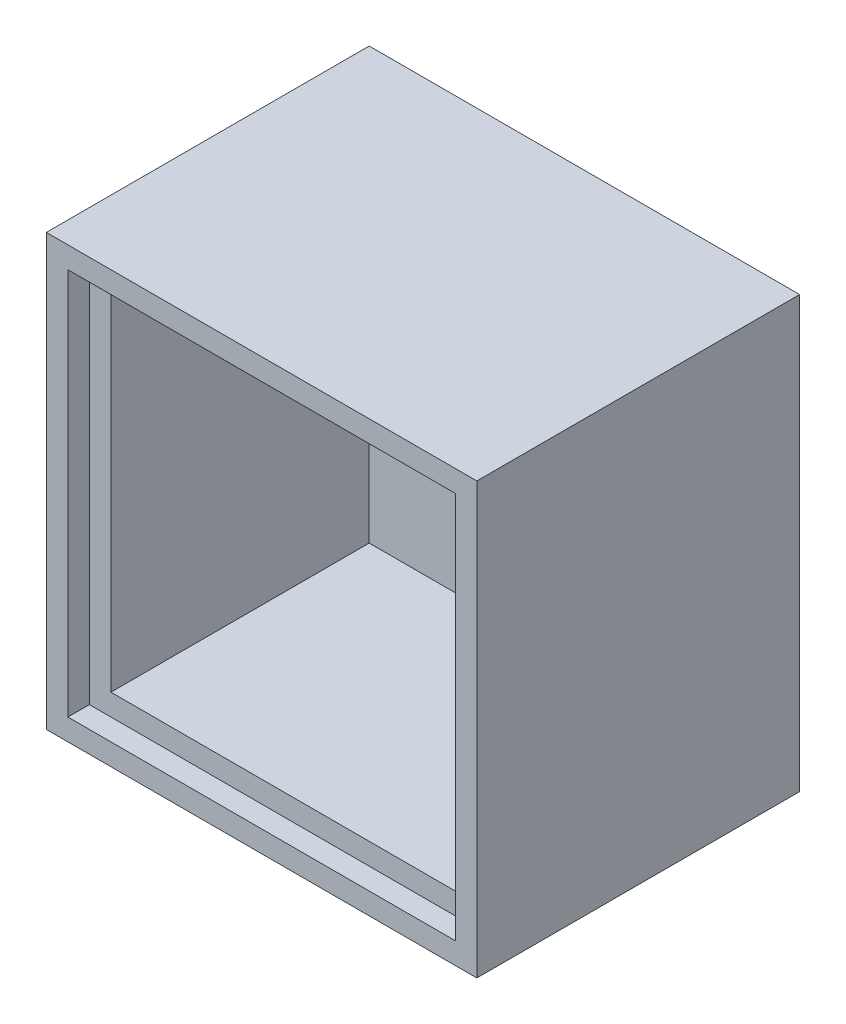
ISO-10303-21;
HEADER;
FILE_DESCRIPTION(('STEP AP214'),'2;1');
FILE_NAME('part.step','',(''),(''),'','','');
FILE_SCHEMA(('AUTOMOTIVE_DESIGN { 1 0 10303 214 1 1 1 1 }'));
ENDSEC;
DATA;
#1=APPLICATION_CONTEXT('core data for automotive mechanical design processes');
#2=APPLICATION_PROTOCOL_DEFINITION('international standard','automotive_design',2000,#1);
#3=PRODUCT_CONTEXT('',#1,'mechanical');
#4=PRODUCT('Part','Part','',(#3));
#5=PRODUCT_RELATED_PRODUCT_CATEGORY('part','',(#4));
#6=PRODUCT_DEFINITION_FORMATION('','',#4);
#7=PRODUCT_DEFINITION_CONTEXT('part definition',#1,'design');
#8=PRODUCT_DEFINITION('design','',#6,#7);
#9=PRODUCT_DEFINITION_SHAPE('','',#8);
#10=(LENGTH_UNIT() NAMED_UNIT(*) SI_UNIT(.MILLI.,.METRE.));
#11=(NAMED_UNIT(*) PLANE_ANGLE_UNIT() SI_UNIT($,.RADIAN.));
#12=(NAMED_UNIT(*) SI_UNIT($,.STERADIAN.) SOLID_ANGLE_UNIT());
#13=UNCERTAINTY_MEASURE_WITH_UNIT(LENGTH_MEASURE(1.E-05),#10,'distance_accuracy_value','');
#14=(GEOMETRIC_REPRESENTATION_CONTEXT(3) GLOBAL_UNCERTAINTY_ASSIGNED_CONTEXT((#13)) GLOBAL_UNIT_ASSIGNED_CONTEXT((#10,
#11,#12)) REPRESENTATION_CONTEXT('',''));
#15=CARTESIAN_POINT('',(0.,0.,0.));
#16=DIRECTION('',(0.,0.,1.));
#17=DIRECTION('',(1.,0.,0.));
#18=AXIS2_PLACEMENT_3D('',#15,#16,#17);
#19=CARTESIAN_POINT('',(50.,50.,75.));
#20=DIRECTION('',(-1.,0.,0.));
#21=DIRECTION('',(0.,-1.,0.));
#22=AXIS2_PLACEMENT_3D('',#19,#20,#21);
#23=PLANE('',#22);
#24=DIRECTION('',(0.,1.,0.));
#25=VECTOR('',#24,1.);
#26=CARTESIAN_POINT('',(50.,50.,0.));
#27=LINE('',#26,#25);
#28=CARTESIAN_POINT('',(50.,-50.,0.));
#29=VERTEX_POINT('',#28);
#30=CARTESIAN_POINT('',(50.,50.,0.));
#31=VERTEX_POINT('',#30);
#32=EDGE_CURVE('E169',#29,#31,#27,.T.);
#33=ORIENTED_EDGE('',*,*,#32,.T.);
#34=DIRECTION('',(0.,0.,-1.));
#35=VECTOR('',#34,1.);
#36=CARTESIAN_POINT('',(50.,50.,75.));
#37=LINE('',#36,#35);
#38=CARTESIAN_POINT('',(50.,50.,75.));
#39=VERTEX_POINT('',#38);
#40=EDGE_CURVE('E40',#39,#31,#37,.T.);
#41=ORIENTED_EDGE('',*,*,#40,.F.);
#42=DIRECTION('',(0.,1.,0.));
#43=VECTOR('',#42,1.);
#44=CARTESIAN_POINT('',(50.,50.,75.));
#45=LINE('',#44,#43);
#46=CARTESIAN_POINT('',(50.,-50.,75.));
#47=VERTEX_POINT('',#46);
#48=EDGE_CURVE('E184',#47,#39,#45,.T.);
#49=ORIENTED_EDGE('',*,*,#48,.F.);
#50=DIRECTION('',(0.,0.,-1.));
#51=VECTOR('',#50,1.);
#52=CARTESIAN_POINT('',(50.,-50.,75.));
#53=LINE('',#52,#51);
#54=EDGE_CURVE('E194',#47,#29,#53,.T.);
#55=ORIENTED_EDGE('',*,*,#54,.T.);
#56=EDGE_LOOP('',(#33,#41,#49,#55));
#57=FACE_BOUND('',#56,.T.);
#58=ADVANCED_FACE('F33',(#57),#23,.F.);
#59=CARTESIAN_POINT('',(-50.,50.,75.));
#60=DIRECTION('',(0.,-1.,0.));
#61=DIRECTION('',(0.,0.,-1.));
#62=AXIS2_PLACEMENT_3D('',#59,#60,#61);
#63=PLANE('',#62);
#64=DIRECTION('',(-1.,0.,0.));
#65=VECTOR('',#64,1.);
#66=CARTESIAN_POINT('',(-50.,50.,0.));
#67=LINE('',#66,#65);
#68=CARTESIAN_POINT('',(-50.,50.,0.));
#69=VERTEX_POINT('',#68);
#70=EDGE_CURVE('E197',#31,#69,#67,.T.);
#71=ORIENTED_EDGE('',*,*,#70,.T.);
#72=DIRECTION('',(0.,0.,-1.));
#73=VECTOR('',#72,1.);
#74=CARTESIAN_POINT('',(-50.,50.,75.));
#75=LINE('',#74,#73);
#76=CARTESIAN_POINT('',(-50.,50.,75.));
#77=VERTEX_POINT('',#76);
#78=EDGE_CURVE('E207',#77,#69,#75,.T.);
#79=ORIENTED_EDGE('',*,*,#78,.F.);
#80=DIRECTION('',(-1.,0.,0.));
#81=VECTOR('',#80,1.);
#82=CARTESIAN_POINT('',(-50.,50.,75.));
#83=LINE('',#82,#81);
#84=EDGE_CURVE('E187',#39,#77,#83,.T.);
#85=ORIENTED_EDGE('',*,*,#84,.F.);
#86=ORIENTED_EDGE('',*,*,#40,.T.);
#87=EDGE_LOOP('',(#71,#79,#85,#86));
#88=FACE_BOUND('',#87,.T.);
#89=ADVANCED_FACE('F212',(#88),#63,.F.);
#90=CARTESIAN_POINT('',(-50.,50.,75.));
#91=DIRECTION('',(1.,0.,0.));
#92=DIRECTION('',(0.,1.,0.));
#93=AXIS2_PLACEMENT_3D('',#90,#91,#92);
#94=PLANE('',#93);
#95=DIRECTION('',(0.,-1.,0.));
#96=VECTOR('',#95,1.);
#97=CARTESIAN_POINT('',(-50.,50.,0.));
#98=LINE('',#97,#96);
#99=CARTESIAN_POINT('',(-50.,-50.,0.));
#100=VERTEX_POINT('',#99);
#101=EDGE_CURVE('E199',#69,#100,#98,.T.);
#102=ORIENTED_EDGE('',*,*,#101,.T.);
#103=DIRECTION('',(0.,0.,-1.));
#104=VECTOR('',#103,1.);
#105=CARTESIAN_POINT('',(-50.,-50.,75.));
#106=LINE('',#105,#104);
#107=CARTESIAN_POINT('',(-50.,-50.,75.));
#108=VERTEX_POINT('',#107);
#109=EDGE_CURVE('E204',#108,#100,#106,.T.);
#110=ORIENTED_EDGE('',*,*,#109,.F.);
#111=DIRECTION('',(0.,-1.,0.));
#112=VECTOR('',#111,1.);
#113=CARTESIAN_POINT('',(-50.,50.,75.));
#114=LINE('',#113,#112);
#115=EDGE_CURVE('E190',#77,#108,#114,.T.);
#116=ORIENTED_EDGE('',*,*,#115,.F.);
#117=ORIENTED_EDGE('',*,*,#78,.T.);
#118=EDGE_LOOP('',(#102,#110,#116,#117));
#119=FACE_BOUND('',#118,.T.);
#120=ADVANCED_FACE('F224',(#119),#94,.F.);
#121=CARTESIAN_POINT('',(-50.,-50.,75.));
#122=DIRECTION('',(0.,1.,0.));
#123=DIRECTION('',(0.,0.,1.));
#124=AXIS2_PLACEMENT_3D('',#121,#122,#123);
#125=PLANE('',#124);
#126=DIRECTION('',(1.,0.,0.));
#127=VECTOR('',#126,1.);
#128=CARTESIAN_POINT('',(-50.,-50.,0.));
#129=LINE('',#128,#127);
#130=EDGE_CURVE('E188',#100,#29,#129,.T.);
#131=ORIENTED_EDGE('',*,*,#130,.T.);
#132=ORIENTED_EDGE('',*,*,#54,.F.);
#133=DIRECTION('',(1.,0.,0.));
#134=VECTOR('',#133,1.);
#135=CARTESIAN_POINT('',(-50.,-50.,75.));
#136=LINE('',#135,#134);
#137=EDGE_CURVE('E192',#108,#47,#136,.T.);
#138=ORIENTED_EDGE('',*,*,#137,.F.);
#139=ORIENTED_EDGE('',*,*,#109,.T.);
#140=EDGE_LOOP('',(#131,#132,#138,#139));
#141=FACE_BOUND('',#140,.T.);
#142=ADVANCED_FACE('F228',(#141),#125,.F.);
#143=CARTESIAN_POINT('',(0.,0.,75.));
#144=DIRECTION('',(0.,0.,1.));
#145=DIRECTION('',(1.,0.,0.));
#146=AXIS2_PLACEMENT_3D('',#143,#144,#145);
#147=PLANE('',#146);
#148=DIRECTION('',(0.,1.,0.));
#149=VECTOR('',#148,1.);
#150=CARTESIAN_POINT('',(45.,-45.,75.));
#151=LINE('',#150,#149);
#152=CARTESIAN_POINT('',(45.,-45.,75.));
#153=VERTEX_POINT('',#152);
#154=CARTESIAN_POINT('',(45.,45.,75.));
#155=VERTEX_POINT('',#154);
#156=EDGE_CURVE('E47',#153,#155,#151,.T.);
#157=ORIENTED_EDGE('',*,*,#156,.F.);
#158=DIRECTION('',(1.,0.,0.));
#159=VECTOR('',#158,1.);
#160=CARTESIAN_POINT('',(-45.,-45.,75.));
#161=LINE('',#160,#159);
#162=CARTESIAN_POINT('',(-45.,-45.,75.));
#163=VERTEX_POINT('',#162);
#164=EDGE_CURVE('E140',#163,#153,#161,.T.);
#165=ORIENTED_EDGE('',*,*,#164,.F.);
#166=DIRECTION('',(0.,-1.,0.));
#167=VECTOR('',#166,1.);
#168=CARTESIAN_POINT('',(-45.,-45.,75.));
#169=LINE('',#168,#167);
#170=CARTESIAN_POINT('',(-45.,45.,75.));
#171=VERTEX_POINT('',#170);
#172=EDGE_CURVE('E143',#171,#163,#169,.T.);
#173=ORIENTED_EDGE('',*,*,#172,.F.);
#174=DIRECTION('',(-1.,0.,0.));
#175=VECTOR('',#174,1.);
#176=CARTESIAN_POINT('',(-45.,45.,75.));
#177=LINE('',#176,#175);
#178=EDGE_CURVE('E149',#155,#171,#177,.T.);
#179=ORIENTED_EDGE('',*,*,#178,.F.);
#180=EDGE_LOOP('',(#157,#165,#173,#179));
#181=FACE_BOUND('',#180,.T.);
#182=ORIENTED_EDGE('',*,*,#48,.T.);
#183=ORIENTED_EDGE('',*,*,#84,.T.);
#184=ORIENTED_EDGE('',*,*,#115,.T.);
#185=ORIENTED_EDGE('',*,*,#137,.T.);
#186=EDGE_LOOP('',(#182,#183,#184,#185));
#187=FACE_BOUND('',#186,.T.);
#188=ADVANCED_FACE('F230',(#181,#187),#147,.T.);
#189=CARTESIAN_POINT('',(0.,0.,0.));
#190=DIRECTION('',(0.,0.,1.));
#191=DIRECTION('',(1.,0.,0.));
#192=AXIS2_PLACEMENT_3D('',#189,#190,#191);
#193=PLANE('',#192);
#194=ORIENTED_EDGE('',*,*,#32,.F.);
#195=ORIENTED_EDGE('',*,*,#130,.F.);
#196=ORIENTED_EDGE('',*,*,#101,.F.);
#197=ORIENTED_EDGE('',*,*,#70,.F.);
#198=EDGE_LOOP('',(#194,#195,#196,#197));
#199=FACE_BOUND('',#198,.T.);
#200=ADVANCED_FACE('F220',(#199),#193,.F.);
#201=CARTESIAN_POINT('',(45.,-45.,70.));
#202=DIRECTION('',(1.,0.,0.));
#203=DIRECTION('',(0.,0.,-1.));
#204=AXIS2_PLACEMENT_3D('',#201,#202,#203);
#205=PLANE('',#204);
#206=ORIENTED_EDGE('',*,*,#156,.T.);
#207=DIRECTION('',(0.,0.,1.));
#208=VECTOR('',#207,1.);
#209=CARTESIAN_POINT('',(45.,45.,70.));
#210=LINE('',#209,#208);
#211=CARTESIAN_POINT('',(45.,45.,70.));
#212=VERTEX_POINT('',#211);
#213=EDGE_CURVE('E118',#212,#155,#210,.T.);
#214=ORIENTED_EDGE('',*,*,#213,.F.);
#215=DIRECTION('',(0.,1.,0.));
#216=VECTOR('',#215,1.);
#217=CARTESIAN_POINT('',(45.,-45.,70.));
#218=LINE('',#217,#216);
#219=CARTESIAN_POINT('',(45.,-45.,70.));
#220=VERTEX_POINT('',#219);
#221=EDGE_CURVE('E122',#220,#212,#218,.T.);
#222=ORIENTED_EDGE('',*,*,#221,.F.);
#223=DIRECTION('',(0.,0.,1.));
#224=VECTOR('',#223,1.);
#225=CARTESIAN_POINT('',(45.,-45.,70.));
#226=LINE('',#225,#224);
#227=EDGE_CURVE('E153',#220,#153,#226,.T.);
#228=ORIENTED_EDGE('',*,*,#227,.T.);
#229=EDGE_LOOP('',(#206,#214,#222,#228));
#230=FACE_BOUND('',#229,.T.);
#231=ADVANCED_FACE('F120',(#230),#205,.F.);
#232=CARTESIAN_POINT('',(-45.,-45.,70.));
#233=DIRECTION('',(0.,-1.,0.));
#234=DIRECTION('',(0.,0.,-1.));
#235=AXIS2_PLACEMENT_3D('',#232,#233,#234);
#236=PLANE('',#235);
#237=ORIENTED_EDGE('',*,*,#164,.T.);
#238=ORIENTED_EDGE('',*,*,#227,.F.);
#239=DIRECTION('',(1.,0.,0.));
#240=VECTOR('',#239,1.);
#241=CARTESIAN_POINT('',(-45.,-45.,70.));
#242=LINE('',#241,#240);
#243=CARTESIAN_POINT('',(-45.,-45.,70.));
#244=VERTEX_POINT('',#243);
#245=EDGE_CURVE('E128',#244,#220,#242,.T.);
#246=ORIENTED_EDGE('',*,*,#245,.F.);
#247=DIRECTION('',(0.,0.,1.));
#248=VECTOR('',#247,1.);
#249=CARTESIAN_POINT('',(-45.,-45.,70.));
#250=LINE('',#249,#248);
#251=EDGE_CURVE('E156',#244,#163,#250,.T.);
#252=ORIENTED_EDGE('',*,*,#251,.T.);
#253=EDGE_LOOP('',(#237,#238,#246,#252));
#254=FACE_BOUND('',#253,.T.);
#255=ADVANCED_FACE('F288',(#254),#236,.F.);
#256=CARTESIAN_POINT('',(-45.,-45.,70.));
#257=DIRECTION('',(-1.,0.,0.));
#258=DIRECTION('',(0.,0.,1.));
#259=AXIS2_PLACEMENT_3D('',#256,#257,#258);
#260=PLANE('',#259);
#261=ORIENTED_EDGE('',*,*,#172,.T.);
#262=ORIENTED_EDGE('',*,*,#251,.F.);
#263=DIRECTION('',(0.,-1.,0.));
#264=VECTOR('',#263,1.);
#265=CARTESIAN_POINT('',(-45.,-45.,70.));
#266=LINE('',#265,#264);
#267=CARTESIAN_POINT('',(-45.,45.,70.));
#268=VERTEX_POINT('',#267);
#269=EDGE_CURVE('E136',#268,#244,#266,.T.);
#270=ORIENTED_EDGE('',*,*,#269,.F.);
#271=DIRECTION('',(0.,0.,1.));
#272=VECTOR('',#271,1.);
#273=CARTESIAN_POINT('',(-45.,45.,70.));
#274=LINE('',#273,#272);
#275=EDGE_CURVE('E127',#268,#171,#274,.T.);
#276=ORIENTED_EDGE('',*,*,#275,.T.);
#277=EDGE_LOOP('',(#261,#262,#270,#276));
#278=FACE_BOUND('',#277,.T.);
#279=ADVANCED_FACE('F297',(#278),#260,.F.);
#280=CARTESIAN_POINT('',(-45.,45.,70.));
#281=DIRECTION('',(0.,1.,0.));
#282=DIRECTION('',(0.,0.,1.));
#283=AXIS2_PLACEMENT_3D('',#280,#281,#282);
#284=PLANE('',#283);
#285=ORIENTED_EDGE('',*,*,#178,.T.);
#286=ORIENTED_EDGE('',*,*,#275,.F.);
#287=DIRECTION('',(-1.,0.,0.));
#288=VECTOR('',#287,1.);
#289=CARTESIAN_POINT('',(-45.,45.,70.));
#290=LINE('',#289,#288);
#291=EDGE_CURVE('E131',#212,#268,#290,.T.);
#292=ORIENTED_EDGE('',*,*,#291,.F.);
#293=ORIENTED_EDGE('',*,*,#213,.T.);
#294=EDGE_LOOP('',(#285,#286,#292,#293));
#295=FACE_BOUND('',#294,.T.);
#296=ADVANCED_FACE('F132',(#295),#284,.F.);
#297=CARTESIAN_POINT('',(0.,0.,70.));
#298=DIRECTION('',(0.,0.,-1.));
#299=DIRECTION('',(-1.,0.,0.));
#300=AXIS2_PLACEMENT_3D('',#297,#298,#299);
#301=PLANE('',#300);
#302=DIRECTION('',(0.,-1.,0.));
#303=VECTOR('',#302,1.);
#304=CARTESIAN_POINT('',(40.,50.,70.));
#305=LINE('',#304,#303);
#306=CARTESIAN_POINT('',(40.,40.,70.));
#307=VERTEX_POINT('',#306);
#308=CARTESIAN_POINT('',(40.,-40.,70.));
#309=VERTEX_POINT('',#308);
#310=EDGE_CURVE('E54',#307,#309,#305,.T.);
#311=ORIENTED_EDGE('',*,*,#310,.T.);
#312=DIRECTION('',(-1.,0.,0.));
#313=VECTOR('',#312,1.);
#314=CARTESIAN_POINT('',(-50.,-40.,70.));
#315=LINE('',#314,#313);
#316=CARTESIAN_POINT('',(-40.,-40.,70.));
#317=VERTEX_POINT('',#316);
#318=EDGE_CURVE('E11',#309,#317,#315,.T.);
#319=ORIENTED_EDGE('',*,*,#318,.T.);
#320=DIRECTION('',(0.,1.,0.));
#321=VECTOR('',#320,1.);
#322=CARTESIAN_POINT('',(-40.,50.,70.));
#323=LINE('',#322,#321);
#324=CARTESIAN_POINT('',(-40.,40.,70.));
#325=VERTEX_POINT('',#324);
#326=EDGE_CURVE('E155',#317,#325,#323,.T.);
#327=ORIENTED_EDGE('',*,*,#326,.T.);
#328=DIRECTION('',(1.,0.,0.));
#329=VECTOR('',#328,1.);
#330=CARTESIAN_POINT('',(-50.,40.,70.));
#331=LINE('',#330,#329);
#332=EDGE_CURVE('E160',#325,#307,#331,.T.);
#333=ORIENTED_EDGE('',*,*,#332,.T.);
#334=EDGE_LOOP('',(#311,#319,#327,#333));
#335=FACE_BOUND('',#334,.T.);
#336=ORIENTED_EDGE('',*,*,#221,.T.);
#337=ORIENTED_EDGE('',*,*,#291,.T.);
#338=ORIENTED_EDGE('',*,*,#269,.T.);
#339=ORIENTED_EDGE('',*,*,#245,.T.);
#340=EDGE_LOOP('',(#336,#337,#338,#339));
#341=FACE_BOUND('',#340,.T.);
#342=ADVANCED_FACE('F138',(#335,#341),#301,.F.);
#343=CARTESIAN_POINT('',(0.,0.,10.));
#344=DIRECTION('',(0.,0.,1.));
#345=DIRECTION('',(1.,0.,0.));
#346=AXIS2_PLACEMENT_3D('',#343,#344,#345);
#347=PLANE('',#346);
#348=DIRECTION('',(0.,1.,0.));
#349=VECTOR('',#348,1.);
#350=CARTESIAN_POINT('',(40.,50.,9.99999999999999));
#351=LINE('',#350,#349);
#352=CARTESIAN_POINT('',(40.,-40.,10.));
#353=VERTEX_POINT('',#352);
#354=CARTESIAN_POINT('',(40.,40.,10.));
#355=VERTEX_POINT('',#354);
#356=EDGE_CURVE('E163',#353,#355,#351,.T.);
#357=ORIENTED_EDGE('',*,*,#356,.T.);
#358=DIRECTION('',(-1.,0.,0.));
#359=VECTOR('',#358,1.);
#360=CARTESIAN_POINT('',(-50.,40.,9.99999999999999));
#361=LINE('',#360,#359);
#362=CARTESIAN_POINT('',(-40.,40.,10.));
#363=VERTEX_POINT('',#362);
#364=EDGE_CURVE('E166',#355,#363,#361,.T.);
#365=ORIENTED_EDGE('',*,*,#364,.T.);
#366=DIRECTION('',(0.,-1.,0.));
#367=VECTOR('',#366,1.);
#368=CARTESIAN_POINT('',(-40.,50.,9.99999999999999));
#369=LINE('',#368,#367);
#370=CARTESIAN_POINT('',(-40.,-40.,10.));
#371=VERTEX_POINT('',#370);
#372=EDGE_CURVE('E177',#363,#371,#369,.T.);
#373=ORIENTED_EDGE('',*,*,#372,.T.);
#374=DIRECTION('',(1.,0.,0.));
#375=VECTOR('',#374,1.);
#376=CARTESIAN_POINT('',(-50.,-40.,9.99999999999999));
#377=LINE('',#376,#375);
#378=EDGE_CURVE('E174',#371,#353,#377,.T.);
#379=ORIENTED_EDGE('',*,*,#378,.T.);
#380=EDGE_LOOP('',(#357,#365,#373,#379));
#381=FACE_BOUND('',#380,.T.);
#382=ADVANCED_FACE('F269',(#381),#347,.T.);
#383=CARTESIAN_POINT('',(-50.,-40.,75.));
#384=DIRECTION('',(0.,1.,0.));
#385=DIRECTION('',(0.,0.,1.));
#386=AXIS2_PLACEMENT_3D('',#383,#384,#385);
#387=PLANE('',#386);
#388=ORIENTED_EDGE('',*,*,#318,.F.);
#389=DIRECTION('',(0.,0.,-1.));
#390=VECTOR('',#389,1.);
#391=CARTESIAN_POINT('',(40.,-40.,75.));
#392=LINE('',#391,#390);
#393=EDGE_CURVE('E171',#309,#353,#392,.T.);
#394=ORIENTED_EDGE('',*,*,#393,.T.);
#395=ORIENTED_EDGE('',*,*,#378,.F.);
#396=DIRECTION('',(0.,0.,-1.));
#397=VECTOR('',#396,1.);
#398=CARTESIAN_POINT('',(-40.,-40.,75.));
#399=LINE('',#398,#397);
#400=EDGE_CURVE('E173',#317,#371,#399,.T.);
#401=ORIENTED_EDGE('',*,*,#400,.F.);
#402=EDGE_LOOP('',(#388,#394,#395,#401));
#403=FACE_BOUND('',#402,.T.);
#404=ADVANCED_FACE('F273',(#403),#387,.T.);
#405=CARTESIAN_POINT('',(-40.,50.,75.));
#406=DIRECTION('',(1.,0.,0.));
#407=DIRECTION('',(0.,1.,0.));
#408=AXIS2_PLACEMENT_3D('',#405,#406,#407);
#409=PLANE('',#408);
#410=ORIENTED_EDGE('',*,*,#326,.F.);
#411=ORIENTED_EDGE('',*,*,#400,.T.);
#412=ORIENTED_EDGE('',*,*,#372,.F.);
#413=DIRECTION('',(0.,0.,-1.));
#414=VECTOR('',#413,1.);
#415=CARTESIAN_POINT('',(-40.,40.,75.));
#416=LINE('',#415,#414);
#417=EDGE_CURVE('E170',#325,#363,#416,.T.);
#418=ORIENTED_EDGE('',*,*,#417,.F.);
#419=EDGE_LOOP('',(#410,#411,#412,#418));
#420=FACE_BOUND('',#419,.T.);
#421=ADVANCED_FACE('F329',(#420),#409,.T.);
#422=CARTESIAN_POINT('',(-50.,40.,75.));
#423=DIRECTION('',(0.,-1.,0.));
#424=DIRECTION('',(0.,0.,-1.));
#425=AXIS2_PLACEMENT_3D('',#422,#423,#424);
#426=PLANE('',#425);
#427=ORIENTED_EDGE('',*,*,#332,.F.);
#428=ORIENTED_EDGE('',*,*,#417,.T.);
#429=ORIENTED_EDGE('',*,*,#364,.F.);
#430=DIRECTION('',(0.,0.,-1.));
#431=VECTOR('',#430,1.);
#432=CARTESIAN_POINT('',(40.,40.,75.));
#433=LINE('',#432,#431);
#434=EDGE_CURVE('E167',#307,#355,#433,.T.);
#435=ORIENTED_EDGE('',*,*,#434,.F.);
#436=EDGE_LOOP('',(#427,#428,#429,#435));
#437=FACE_BOUND('',#436,.T.);
#438=ADVANCED_FACE('F339',(#437),#426,.T.);
#439=CARTESIAN_POINT('',(40.,50.,75.));
#440=DIRECTION('',(-1.,0.,0.));
#441=DIRECTION('',(0.,-1.,0.));
#442=AXIS2_PLACEMENT_3D('',#439,#440,#441);
#443=PLANE('',#442);
#444=ORIENTED_EDGE('',*,*,#310,.F.);
#445=ORIENTED_EDGE('',*,*,#434,.T.);
#446=ORIENTED_EDGE('',*,*,#356,.F.);
#447=ORIENTED_EDGE('',*,*,#393,.F.);
#448=EDGE_LOOP('',(#444,#445,#446,#447));
#449=FACE_BOUND('',#448,.T.);
#450=ADVANCED_FACE('F349',(#449),#443,.T.);
#451=CLOSED_SHELL('',(#58,#89,#120,#142,#188,#200,#231,#255,#279,#296,#342,#382,#404,#421,#438,#450));
#452=MANIFOLD_SOLID_BREP('B2',#451);
#453=ADVANCED_BREP_SHAPE_REPRESENTATION('',(#18,#452),#14);
#454=SHAPE_DEFINITION_REPRESENTATION(#9,#453);
ENDSEC;
END-ISO-10303-21;
